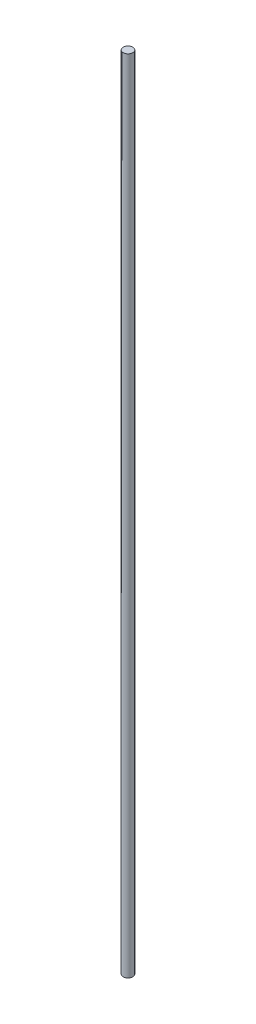
ISO-10303-21;
HEADER;
FILE_DESCRIPTION(('STEP AP214'),'2;1');
FILE_NAME('part.step','',(''),(''),'','','');
FILE_SCHEMA(('AUTOMOTIVE_DESIGN { 1 0 10303 214 1 1 1 1 }'));
ENDSEC;
DATA;
#1=APPLICATION_CONTEXT('core data for automotive mechanical design processes');
#2=APPLICATION_PROTOCOL_DEFINITION('international standard','automotive_design',2000,#1);
#3=PRODUCT_CONTEXT('',#1,'mechanical');
#4=PRODUCT('Part','Part','',(#3));
#5=PRODUCT_RELATED_PRODUCT_CATEGORY('part','',(#4));
#6=PRODUCT_DEFINITION_FORMATION('','',#4);
#7=PRODUCT_DEFINITION_CONTEXT('part definition',#1,'design');
#8=PRODUCT_DEFINITION('design','',#6,#7);
#9=PRODUCT_DEFINITION_SHAPE('','',#8);
#10=(LENGTH_UNIT() NAMED_UNIT(*) SI_UNIT(.MILLI.,.METRE.));
#11=(NAMED_UNIT(*) PLANE_ANGLE_UNIT() SI_UNIT($,.RADIAN.));
#12=(NAMED_UNIT(*) SI_UNIT($,.STERADIAN.) SOLID_ANGLE_UNIT());
#13=UNCERTAINTY_MEASURE_WITH_UNIT(LENGTH_MEASURE(1.E-05),#10,'distance_accuracy_value','');
#14=(GEOMETRIC_REPRESENTATION_CONTEXT(3) GLOBAL_UNCERTAINTY_ASSIGNED_CONTEXT((#13)) GLOBAL_UNIT_ASSIGNED_CONTEXT((#10,
#11,#12)) REPRESENTATION_CONTEXT('',''));
#15=CARTESIAN_POINT('',(0.,0.,0.));
#16=DIRECTION('',(0.,0.,1.));
#17=DIRECTION('',(1.,0.,0.));
#18=AXIS2_PLACEMENT_3D('',#15,#16,#17);
#19=CARTESIAN_POINT('',(-0.790093299984511,250.,0.129411833618158));
#20=DIRECTION('',(0.,-1.,0.));
#21=DIRECTION('',(0.,0.,-1.));
#22=AXIS2_PLACEMENT_3D('',#19,#20,#21);
#23=CYLINDRICAL_SURFACE('',#22,1.5);
#24=CARTESIAN_POINT('',(-0.790093299984511,250.,0.129411833618158));
#25=DIRECTION('',(0.,1.,0.));
#26=DIRECTION('',(0.,0.,1.));
#27=AXIS2_PLACEMENT_3D('',#24,#25,#26);
#28=CIRCLE('',#27,1.5);
#29=CARTESIAN_POINT('',(-0.790093299984511,250.,1.62941183361816));
#30=VERTEX_POINT('',#29);
#31=EDGE_CURVE('E10',#30,#30,#28,.T.);
#32=ORIENTED_EDGE('',*,*,#31,.F.);
#33=EDGE_LOOP('',(#32));
#34=FACE_BOUND('',#33,.T.);
#35=CARTESIAN_POINT('',(-0.790093299984511,0.,0.129411833618158));
#36=DIRECTION('',(0.,1.,0.));
#37=DIRECTION('',(0.,0.,1.));
#38=AXIS2_PLACEMENT_3D('',#35,#36,#37);
#39=CIRCLE('',#38,1.5);
#40=CARTESIAN_POINT('',(-0.790093299984511,0.,1.62941183361816));
#41=VERTEX_POINT('',#40);
#42=EDGE_CURVE('E40',#41,#41,#39,.T.);
#43=ORIENTED_EDGE('',*,*,#42,.T.);
#44=EDGE_LOOP('',(#43));
#45=FACE_BOUND('',#44,.T.);
#46=ADVANCED_FACE('F37',(#34,#45),#23,.T.);
#47=CARTESIAN_POINT('',(-0.790093299984511,250.,0.129411833618158));
#48=DIRECTION('',(0.,1.,0.));
#49=DIRECTION('',(0.,0.,1.));
#50=AXIS2_PLACEMENT_3D('',#47,#48,#49);
#51=PLANE('',#50);
#52=ORIENTED_EDGE('',*,*,#31,.T.);
#53=EDGE_LOOP('',(#52));
#54=FACE_BOUND('',#53,.T.);
#55=ADVANCED_FACE('F52',(#54),#51,.T.);
#56=CARTESIAN_POINT('',(-0.790093299984511,0.,0.129411833618158));
#57=DIRECTION('',(0.,1.,0.));
#58=DIRECTION('',(0.,0.,1.));
#59=AXIS2_PLACEMENT_3D('',#56,#57,#58);
#60=PLANE('',#59);
#61=ORIENTED_EDGE('',*,*,#42,.F.);
#62=EDGE_LOOP('',(#61));
#63=FACE_BOUND('',#62,.T.);
#64=ADVANCED_FACE('F50',(#63),#60,.F.);
#65=CLOSED_SHELL('',(#46,#55,#64));
#66=MANIFOLD_SOLID_BREP('B2',#65);
#67=ADVANCED_BREP_SHAPE_REPRESENTATION('',(#18,#66),#14);
#68=SHAPE_DEFINITION_REPRESENTATION(#9,#67);
ENDSEC;
END-ISO-10303-21;
